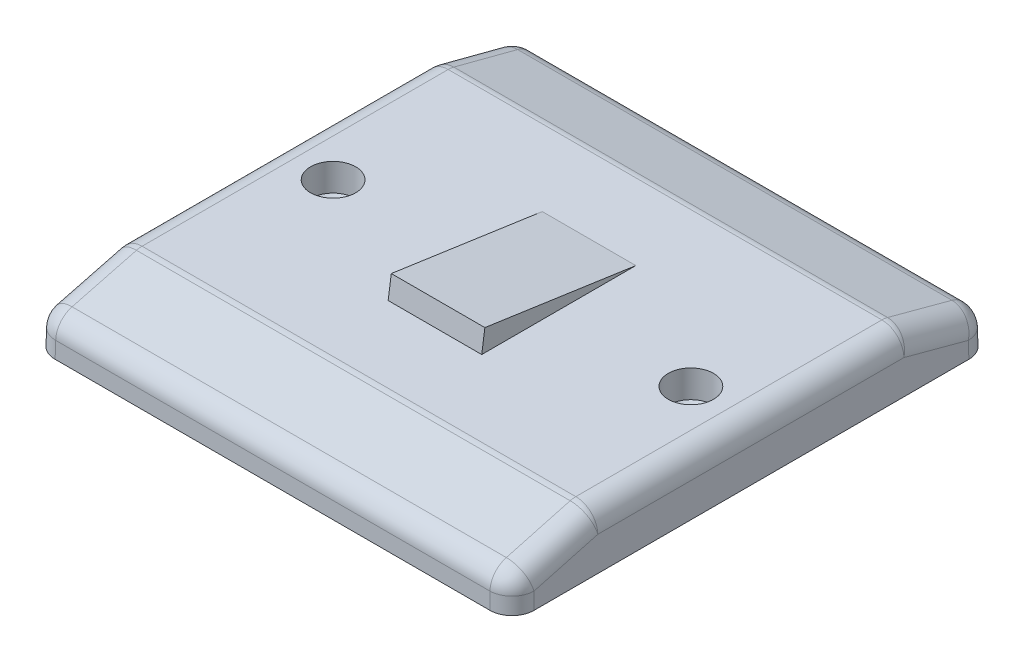
ISO-10303-21;
HEADER;
FILE_DESCRIPTION(('STEP AP214'),'2;1');
FILE_NAME('part.step','',(''),(''),'','','');
FILE_SCHEMA(('AUTOMOTIVE_DESIGN { 1 0 10303 214 1 1 1 1 }'));
ENDSEC;
DATA;
#1=APPLICATION_CONTEXT('core data for automotive mechanical design processes');
#2=APPLICATION_PROTOCOL_DEFINITION('international standard','automotive_design',2000,#1);
#3=PRODUCT_CONTEXT('',#1,'mechanical');
#4=PRODUCT('Part','Part','',(#3));
#5=PRODUCT_RELATED_PRODUCT_CATEGORY('part','',(#4));
#6=PRODUCT_DEFINITION_FORMATION('','',#4);
#7=PRODUCT_DEFINITION_CONTEXT('part definition',#1,'design');
#8=PRODUCT_DEFINITION('design','',#6,#7);
#9=PRODUCT_DEFINITION_SHAPE('','',#8);
#10=(LENGTH_UNIT() NAMED_UNIT(*) SI_UNIT(.MILLI.,.METRE.));
#11=(NAMED_UNIT(*) PLANE_ANGLE_UNIT() SI_UNIT($,.RADIAN.));
#12=(NAMED_UNIT(*) SI_UNIT($,.STERADIAN.) SOLID_ANGLE_UNIT());
#13=UNCERTAINTY_MEASURE_WITH_UNIT(LENGTH_MEASURE(1.E-05),#10,'distance_accuracy_value','');
#14=(GEOMETRIC_REPRESENTATION_CONTEXT(3) GLOBAL_UNCERTAINTY_ASSIGNED_CONTEXT((#13)) GLOBAL_UNIT_ASSIGNED_CONTEXT((#10,
#11,#12)) REPRESENTATION_CONTEXT('',''));
#15=CARTESIAN_POINT('',(0.,0.,0.));
#16=DIRECTION('',(0.,0.,1.));
#17=DIRECTION('',(1.,0.,0.));
#18=AXIS2_PLACEMENT_3D('',#15,#16,#17);
#19=CARTESIAN_POINT('',(0.,10.,0.));
#20=DIRECTION('',(0.,-1.,0.));
#21=DIRECTION('',(0.,0.,-1.));
#22=AXIS2_PLACEMENT_3D('',#19,#20,#21);
#23=PLANE('',#22);
#24=CARTESIAN_POINT('',(-32.5,10.,0.));
#25=DIRECTION('',(0.,1.,0.));
#26=DIRECTION('',(0.,0.,1.));
#27=AXIS2_PLACEMENT_3D('',#24,#25,#26);
#28=CIRCLE('',#27,4.1);
#29=CARTESIAN_POINT('',(-32.5,10.,4.1));
#30=VERTEX_POINT('',#29);
#31=EDGE_CURVE('E793',#30,#30,#28,.T.);
#32=ORIENTED_EDGE('',*,*,#31,.F.);
#33=EDGE_LOOP('',(#32));
#34=FACE_BOUND('',#33,.T.);
#35=CARTESIAN_POINT('',(32.5,10.,0.));
#36=DIRECTION('',(0.,1.,0.));
#37=DIRECTION('',(0.,0.,1.));
#38=AXIS2_PLACEMENT_3D('',#35,#36,#37);
#39=CIRCLE('',#38,4.1);
#40=CARTESIAN_POINT('',(32.5,10.,4.09999999999999));
#41=VERTEX_POINT('',#40);
#42=EDGE_CURVE('E803',#41,#41,#39,.T.);
#43=ORIENTED_EDGE('',*,*,#42,.F.);
#44=EDGE_LOOP('',(#43));
#45=FACE_BOUND('',#44,.T.);
#46=DIRECTION('',(-1.,0.,0.));
#47=VECTOR('',#46,1.);
#48=CARTESIAN_POINT('',(-43.3254493507178,10.,-27.8036982226521));
#49=LINE('',#48,#47);
#50=CARTESIAN_POINT('',(39.3946602982551,10.,-27.8036982226521));
#51=VERTEX_POINT('',#50);
#52=CARTESIAN_POINT('',(-39.3946602982551,10.,-27.8036982226521));
#53=VERTEX_POINT('',#52);
#54=EDGE_CURVE('E42',#51,#53,#49,.T.);
#55=ORIENTED_EDGE('',*,*,#54,.T.);
#56=DIRECTION('',(0.,0.,-1.));
#57=VECTOR('',#56,1.);
#58=CARTESIAN_POINT('',(-39.3946602982551,10.,0.));
#59=LINE('',#58,#57);
#60=CARTESIAN_POINT('',(-39.3946602982551,10.,27.8036982226521));
#61=VERTEX_POINT('',#60);
#62=EDGE_CURVE('E11',#53,#61,#59,.F.);
#63=ORIENTED_EDGE('',*,*,#62,.T.);
#64=DIRECTION('',(1.,0.,0.));
#65=VECTOR('',#64,1.);
#66=CARTESIAN_POINT('',(43.3254493507178,10.,27.8036982226521));
#67=LINE('',#66,#65);
#68=CARTESIAN_POINT('',(39.3946602982551,10.,27.8036982226521));
#69=VERTEX_POINT('',#68);
#70=EDGE_CURVE('E261',#61,#69,#67,.T.);
#71=ORIENTED_EDGE('',*,*,#70,.T.);
#72=DIRECTION('',(0.,0.,1.));
#73=VECTOR('',#72,1.);
#74=CARTESIAN_POINT('',(39.3946602982551,10.,0.));
#75=LINE('',#74,#73);
#76=EDGE_CURVE('E53',#69,#51,#75,.F.);
#77=ORIENTED_EDGE('',*,*,#76,.T.);
#78=EDGE_LOOP('',(#55,#63,#71,#77));
#79=FACE_BOUND('',#78,.T.);
#80=DIRECTION('',(0.,0.,-1.));
#81=VECTOR('',#80,1.);
#82=CARTESIAN_POINT('',(8.5,10.,-14.));
#83=LINE('',#82,#81);
#84=CARTESIAN_POINT('',(8.5,10.,14.));
#85=VERTEX_POINT('',#84);
#86=CARTESIAN_POINT('',(8.5,10.,-14.));
#87=VERTEX_POINT('',#86);
#88=EDGE_CURVE('E173',#85,#87,#83,.T.);
#89=ORIENTED_EDGE('',*,*,#88,.F.);
#90=DIRECTION('',(-1.,0.,0.));
#91=VECTOR('',#90,1.);
#92=CARTESIAN_POINT('',(8.5,10.,14.));
#93=LINE('',#92,#91);
#94=CARTESIAN_POINT('',(-8.5,10.,14.));
#95=VERTEX_POINT('',#94);
#96=EDGE_CURVE('E190',#85,#95,#93,.T.);
#97=ORIENTED_EDGE('',*,*,#96,.T.);
#98=DIRECTION('',(0.,0.,-1.));
#99=VECTOR('',#98,1.);
#100=CARTESIAN_POINT('',(-8.5,10.,-14.));
#101=LINE('',#100,#99);
#102=CARTESIAN_POINT('',(-8.5,10.,-14.));
#103=VERTEX_POINT('',#102);
#104=EDGE_CURVE('E184',#95,#103,#101,.T.);
#105=ORIENTED_EDGE('',*,*,#104,.T.);
#106=DIRECTION('',(-1.,0.,0.));
#107=VECTOR('',#106,1.);
#108=CARTESIAN_POINT('',(8.5,10.,-14.));
#109=LINE('',#108,#107);
#110=EDGE_CURVE('E166',#87,#103,#109,.T.);
#111=ORIENTED_EDGE('',*,*,#110,.F.);
#112=EDGE_LOOP('',(#89,#97,#105,#111));
#113=FACE_BOUND('',#112,.T.);
#114=ADVANCED_FACE('F33',(#34,#45,#79,#113),#23,.F.);
#115=CARTESIAN_POINT('',(43.5,0.,43.5));
#116=DIRECTION('',(0.999847695156391,0.0174524064372835,0.));
#117=DIRECTION('',(-0.0174524064372835,0.999847695156391,0.));
#118=AXIS2_PLACEMENT_3D('',#115,#116,#117);
#119=PLANE('',#118);
#120=DIRECTION('',(0.,0.,-1.));
#121=VECTOR('',#120,1.);
#122=CARTESIAN_POINT('',(43.5,0.,43.5));
#123=LINE('',#122,#121);
#124=CARTESIAN_POINT('',(43.5,0.,39.5006092193744));
#125=VERTEX_POINT('',#124);
#126=CARTESIAN_POINT('',(43.5,0.,-39.5006092193744));
#127=VERTEX_POINT('',#126);
#128=EDGE_CURVE('E185',#125,#127,#123,.T.);
#129=ORIENTED_EDGE('',*,*,#128,.T.);
#130=DIRECTION('',(-0.0174497491606827,0.999695459881888,0.0174497491606827));
#131=VECTOR('',#130,1.);
#132=CARTESIAN_POINT('',(43.4747268335975,1.44789873348481,-39.475336052972));
#133=LINE('',#132,#131);
#134=CARTESIAN_POINT('',(43.4479951271853,2.97935716816603,-39.4486043465598));
#135=VERTEX_POINT('',#134);
#136=EDGE_CURVE('E244',#127,#135,#133,.T.);
#137=ORIENTED_EDGE('',*,*,#136,.T.);
#138=DIRECTION('',(-0.0044773761209927,0.25650870617815,0.966531549799531));
#139=VECTOR('',#138,1.);
#140=CARTESIAN_POINT('',(43.3917938263774,6.199127535052,-27.3164249399725));
#141=LINE('',#140,#139);
#142=CARTESIAN_POINT('',(43.3940510788806,6.06980962574913,-27.8036982226521));
#143=VERTEX_POINT('',#142);
#144=EDGE_CURVE('E242',#135,#143,#141,.T.);
#145=ORIENTED_EDGE('',*,*,#144,.T.);
#146=DIRECTION('',(0.,0.,-1.));
#147=VECTOR('',#146,1.);
#148=CARTESIAN_POINT('',(43.3940510788806,6.06980962574913,43.5));
#149=LINE('',#148,#147);
#150=CARTESIAN_POINT('',(43.3940510788806,6.06980962574913,27.8036982226521));
#151=VERTEX_POINT('',#150);
#152=EDGE_CURVE('E238',#143,#151,#149,.F.);
#153=ORIENTED_EDGE('',*,*,#152,.T.);
#154=DIRECTION('',(0.0044773761209927,-0.25650870617815,0.966531549799531));
#155=VECTOR('',#154,1.);
#156=CARTESIAN_POINT('',(43.4616034521265,2.19973675442642,42.3862345657218));
#157=LINE('',#156,#155);
#158=CARTESIAN_POINT('',(43.4479951271853,2.97935716816603,39.4486043465597));
#159=VERTEX_POINT('',#158);
#160=EDGE_CURVE('E236',#151,#159,#157,.T.);
#161=ORIENTED_EDGE('',*,*,#160,.T.);
#162=DIRECTION('',(-0.0174497491606827,0.999695459881888,-0.0174497491606827));
#163=VECTOR('',#162,1.);
#164=CARTESIAN_POINT('',(43.5012177894796,-0.0697671125602638,39.501827008854));
#165=LINE('',#164,#163);
#166=EDGE_CURVE('E240',#159,#125,#165,.F.);
#167=ORIENTED_EDGE('',*,*,#166,.T.);
#168=EDGE_LOOP('',(#129,#137,#145,#153,#161,#167));
#169=FACE_BOUND('',#168,.T.);
#170=ADVANCED_FACE('F356',(#169),#119,.T.);
#171=CARTESIAN_POINT('',(-43.5,0.,-43.5));
#172=DIRECTION('',(0.,0.0174524064372835,-0.999847695156391));
#173=DIRECTION('',(0.,0.999847695156391,0.0174524064372835));
#174=AXIS2_PLACEMENT_3D('',#171,#172,#173);
#175=PLANE('',#174);
#176=DIRECTION('',(-1.,0.,0.));
#177=VECTOR('',#176,1.);
#178=CARTESIAN_POINT('',(-43.5,0.,-43.5));
#179=LINE('',#178,#177);
#180=CARTESIAN_POINT('',(39.5006092193744,0.,-43.5));
#181=VERTEX_POINT('',#180);
#182=CARTESIAN_POINT('',(-39.5006092193744,0.,-43.5));
#183=VERTEX_POINT('',#182);
#184=EDGE_CURVE('E188',#181,#183,#179,.T.);
#185=ORIENTED_EDGE('',*,*,#184,.T.);
#186=DIRECTION('',(0.0174497491606827,0.999695459881888,0.0174497491606827));
#187=VECTOR('',#186,1.);
#188=CARTESIAN_POINT('',(-39.501827008854,-0.0697671125602636,-43.5012177894796));
#189=LINE('',#188,#187);
#190=CARTESIAN_POINT('',(-39.4486043465597,2.97935716816603,-43.4479951271853));
#191=VERTEX_POINT('',#190);
#192=EDGE_CURVE('E207',#183,#191,#189,.T.);
#193=ORIENTED_EDGE('',*,*,#192,.T.);
#194=DIRECTION('',(1.,0.,0.));
#195=VECTOR('',#194,1.);
#196=CARTESIAN_POINT('',(43.3952589764669,2.97935716816603,-43.4479951271853));
#197=LINE('',#196,#195);
#198=CARTESIAN_POINT('',(39.4486043465598,2.97935716816603,-43.4479951271853));
#199=VERTEX_POINT('',#198);
#200=EDGE_CURVE('E204',#191,#199,#197,.T.);
#201=ORIENTED_EDGE('',*,*,#200,.T.);
#202=DIRECTION('',(-0.0174497491606827,0.999695459881888,0.0174497491606827));
#203=VECTOR('',#202,1.);
#204=CARTESIAN_POINT('',(39.475336052972,1.44789873348481,-43.4747268335975));
#205=LINE('',#204,#203);
#206=EDGE_CURVE('E202',#199,#181,#205,.F.);
#207=ORIENTED_EDGE('',*,*,#206,.T.);
#208=EDGE_LOOP('',(#185,#193,#201,#207));
#209=FACE_BOUND('',#208,.T.);
#210=ADVANCED_FACE('F362',(#209),#175,.T.);
#211=CARTESIAN_POINT('',(-43.5,0.,43.5));
#212=DIRECTION('',(-0.999847695156391,0.0174524064372835,0.));
#213=DIRECTION('',(-0.0174524064372835,-0.999847695156391,0.));
#214=AXIS2_PLACEMENT_3D('',#211,#212,#213);
#215=PLANE('',#214);
#216=DIRECTION('',(-0.0044773761209927,-0.25650870617815,-0.966531549799531));
#217=VECTOR('',#216,1.);
#218=CARTESIAN_POINT('',(-43.4616034521265,2.19973675442641,-42.3862345657219));
#219=LINE('',#218,#217);
#220=CARTESIAN_POINT('',(-43.3940510788806,6.06980962574913,-27.8036982226521));
#221=VERTEX_POINT('',#220);
#222=CARTESIAN_POINT('',(-43.4479951271853,2.97935716816603,-39.4486043465598));
#223=VERTEX_POINT('',#222);
#224=EDGE_CURVE('E220',#221,#223,#219,.T.);
#225=ORIENTED_EDGE('',*,*,#224,.T.);
#226=DIRECTION('',(0.0174497491606827,0.999695459881888,0.0174497491606827));
#227=VECTOR('',#226,1.);
#228=CARTESIAN_POINT('',(-43.4747268335975,1.44789873348481,-39.475336052972));
#229=LINE('',#228,#227);
#230=CARTESIAN_POINT('',(-43.5,0.,-39.5006092193744));
#231=VERTEX_POINT('',#230);
#232=EDGE_CURVE('E226',#223,#231,#229,.F.);
#233=ORIENTED_EDGE('',*,*,#232,.T.);
#234=DIRECTION('',(0.,0.,1.));
#235=VECTOR('',#234,1.);
#236=CARTESIAN_POINT('',(-43.5,0.,43.5));
#237=LINE('',#236,#235);
#238=CARTESIAN_POINT('',(-43.5,0.,39.5006092193744));
#239=VERTEX_POINT('',#238);
#240=EDGE_CURVE('E196',#231,#239,#237,.T.);
#241=ORIENTED_EDGE('',*,*,#240,.T.);
#242=DIRECTION('',(0.0174497491606827,0.999695459881888,-0.0174497491606827));
#243=VECTOR('',#242,1.);
#244=CARTESIAN_POINT('',(-43.5012177894796,-0.0697671125602638,39.501827008854));
#245=LINE('',#244,#243);
#246=CARTESIAN_POINT('',(-43.4479951271853,2.97935716816603,39.4486043465597));
#247=VERTEX_POINT('',#246);
#248=EDGE_CURVE('E224',#239,#247,#245,.T.);
#249=ORIENTED_EDGE('',*,*,#248,.T.);
#250=DIRECTION('',(0.0044773761209927,0.25650870617815,-0.966531549799531));
#251=VECTOR('',#250,1.);
#252=CARTESIAN_POINT('',(-43.3917938263774,6.19912753505201,27.3164249399724));
#253=LINE('',#252,#251);
#254=CARTESIAN_POINT('',(-43.3940510788806,6.06980962574913,27.8036982226521));
#255=VERTEX_POINT('',#254);
#256=EDGE_CURVE('E222',#247,#255,#253,.T.);
#257=ORIENTED_EDGE('',*,*,#256,.T.);
#258=DIRECTION('',(0.,0.,1.));
#259=VECTOR('',#258,1.);
#260=CARTESIAN_POINT('',(-43.3940510788806,6.06980962574913,43.5));
#261=LINE('',#260,#259);
#262=EDGE_CURVE('E218',#255,#221,#261,.F.);
#263=ORIENTED_EDGE('',*,*,#262,.T.);
#264=EDGE_LOOP('',(#225,#233,#241,#249,#257,#263));
#265=FACE_BOUND('',#264,.T.);
#266=ADVANCED_FACE('F377',(#265),#215,.T.);
#267=CARTESIAN_POINT('',(-43.5,0.,43.5));
#268=DIRECTION('',(0.,0.0174524064372835,0.999847695156391));
#269=DIRECTION('',(0.,-0.999847695156391,0.0174524064372835));
#270=AXIS2_PLACEMENT_3D('',#267,#268,#269);
#271=PLANE('',#270);
#272=DIRECTION('',(1.,0.,0.));
#273=VECTOR('',#272,1.);
#274=CARTESIAN_POINT('',(-43.5,0.,43.5));
#275=LINE('',#274,#273);
#276=CARTESIAN_POINT('',(-39.5006092193744,0.,43.5));
#277=VERTEX_POINT('',#276);
#278=CARTESIAN_POINT('',(39.5006092193744,0.,43.5));
#279=VERTEX_POINT('',#278);
#280=EDGE_CURVE('E199',#277,#279,#275,.T.);
#281=ORIENTED_EDGE('',*,*,#280,.T.);
#282=DIRECTION('',(-0.0174497491606827,0.999695459881888,-0.0174497491606827));
#283=VECTOR('',#282,1.);
#284=CARTESIAN_POINT('',(39.475336052972,1.44789873348481,43.4747268335975));
#285=LINE('',#284,#283);
#286=CARTESIAN_POINT('',(39.4486043465598,2.97935716816603,43.4479951271853));
#287=VERTEX_POINT('',#286);
#288=EDGE_CURVE('E250',#279,#287,#285,.T.);
#289=ORIENTED_EDGE('',*,*,#288,.T.);
#290=DIRECTION('',(-1.,0.,0.));
#291=VECTOR('',#290,1.);
#292=CARTESIAN_POINT('',(-43.3952589764669,2.97935716816603,43.4479951271853));
#293=LINE('',#292,#291);
#294=CARTESIAN_POINT('',(-39.4486043465597,2.97935716816603,43.4479951271853));
#295=VERTEX_POINT('',#294);
#296=EDGE_CURVE('E246',#287,#295,#293,.T.);
#297=ORIENTED_EDGE('',*,*,#296,.T.);
#298=DIRECTION('',(0.0174497491606827,0.999695459881888,-0.0174497491606827));
#299=VECTOR('',#298,1.);
#300=CARTESIAN_POINT('',(-39.501827008854,-0.0697671125602638,43.5012177894796));
#301=LINE('',#300,#299);
#302=EDGE_CURVE('E248',#295,#277,#301,.F.);
#303=ORIENTED_EDGE('',*,*,#302,.T.);
#304=EDGE_LOOP('',(#281,#289,#297,#303));
#305=FACE_BOUND('',#304,.T.);
#306=ADVANCED_FACE('F372',(#305),#271,.T.);
#307=CARTESIAN_POINT('',(0.,0.,0.));
#308=DIRECTION('',(0.,-1.,0.));
#309=DIRECTION('',(0.,0.,-1.));
#310=AXIS2_PLACEMENT_3D('',#307,#308,#309);
#311=PLANE('',#310);
#312=CARTESIAN_POINT('',(-32.5,0.,0.));
#313=DIRECTION('',(0.,1.,0.));
#314=DIRECTION('',(0.,0.,1.));
#315=AXIS2_PLACEMENT_3D('',#312,#313,#314);
#316=CIRCLE('',#315,1.95);
#317=CARTESIAN_POINT('',(-32.5,0.,1.94999999999999));
#318=VERTEX_POINT('',#317);
#319=EDGE_CURVE('E800',#318,#318,#316,.T.);
#320=ORIENTED_EDGE('',*,*,#319,.T.);
#321=EDGE_LOOP('',(#320));
#322=FACE_BOUND('',#321,.T.);
#323=CARTESIAN_POINT('',(32.5,0.,0.));
#324=DIRECTION('',(0.,1.,0.));
#325=DIRECTION('',(0.,0.,1.));
#326=AXIS2_PLACEMENT_3D('',#323,#324,#325);
#327=CIRCLE('',#326,1.95);
#328=CARTESIAN_POINT('',(32.5,0.,1.94999999999999));
#329=VERTEX_POINT('',#328);
#330=EDGE_CURVE('E268',#329,#329,#327,.T.);
#331=ORIENTED_EDGE('',*,*,#330,.T.);
#332=EDGE_LOOP('',(#331));
#333=FACE_BOUND('',#332,.T.);
#334=ORIENTED_EDGE('',*,*,#240,.F.);
#335=CARTESIAN_POINT('',(-39.4993906878244,0.,-39.4993906878244));
#336=DIRECTION('',(0.,-1.,0.));
#337=DIRECTION('',(-0.707106781186548,0.,-0.707106781186548));
#338=AXIS2_PLACEMENT_3D('',#335,#336,#337);
#339=ELLIPSE('',#338,4.0012185315642,4.);
#340=EDGE_CURVE('E234',#231,#183,#339,.T.);
#341=ORIENTED_EDGE('',*,*,#340,.T.);
#342=ORIENTED_EDGE('',*,*,#184,.F.);
#343=CARTESIAN_POINT('',(39.4993906878244,0.,-39.4993906878244));
#344=DIRECTION('',(0.,-1.,0.));
#345=DIRECTION('',(0.707106781186548,0.,-0.707106781186548));
#346=AXIS2_PLACEMENT_3D('',#343,#344,#345);
#347=ELLIPSE('',#346,4.0012185315642,4.);
#348=EDGE_CURVE('E232',#181,#127,#347,.T.);
#349=ORIENTED_EDGE('',*,*,#348,.T.);
#350=ORIENTED_EDGE('',*,*,#128,.F.);
#351=CARTESIAN_POINT('',(39.4993906878244,0.,39.4993906878244));
#352=DIRECTION('',(0.,-1.,0.));
#353=DIRECTION('',(0.707106781186548,0.,0.707106781186548));
#354=AXIS2_PLACEMENT_3D('',#351,#352,#353);
#355=ELLIPSE('',#354,4.0012185315642,4.);
#356=EDGE_CURVE('E230',#125,#279,#355,.T.);
#357=ORIENTED_EDGE('',*,*,#356,.T.);
#358=ORIENTED_EDGE('',*,*,#280,.F.);
#359=CARTESIAN_POINT('',(-39.4993906878244,0.,39.4993906878244));
#360=DIRECTION('',(0.,-1.,0.));
#361=DIRECTION('',(-0.707106781186548,0.,0.707106781186548));
#362=AXIS2_PLACEMENT_3D('',#359,#360,#361);
#363=ELLIPSE('',#362,4.0012185315642,4.);
#364=EDGE_CURVE('E228',#277,#239,#363,.T.);
#365=ORIENTED_EDGE('',*,*,#364,.T.);
#366=EDGE_LOOP('',(#334,#341,#342,#349,#350,#357,#358,#365));
#367=FACE_BOUND('',#366,.T.);
#368=ADVANCED_FACE('F369',(#322,#333,#367),#311,.T.);
#369=CARTESIAN_POINT('',(0.,10.,-28.3254493507176));
#370=DIRECTION('',(0.,0.966541237924372,-0.256511277318604));
#371=DIRECTION('',(1.,0.,0.));
#372=AXIS2_PLACEMENT_3D('',#369,#370,#371);
#373=PLANE('',#372);
#374=DIRECTION('',(0.0044773761209927,-0.25650870617815,-0.966531549799531));
#375=VECTOR('',#374,1.);
#376=CARTESIAN_POINT('',(39.4622126715009,5.99609208037477,-43.4122796749963));
#377=LINE('',#376,#375);
#378=CARTESIAN_POINT('',(39.3946602982551,9.86616495169749,-28.8297433319265));
#379=VERTEX_POINT('',#378);
#380=CARTESIAN_POINT('',(39.4486043465598,6.77571249411439,-40.4746494558342));
#381=VERTEX_POINT('',#380);
#382=EDGE_CURVE('E213',#379,#381,#377,.T.);
#383=ORIENTED_EDGE('',*,*,#382,.T.);
#384=DIRECTION('',(-1.,0.,0.));
#385=VECTOR('',#384,1.);
#386=CARTESIAN_POINT('',(-43.3952589764669,6.77571249411439,-40.4746494558342));
#387=LINE('',#386,#385);
#388=CARTESIAN_POINT('',(-39.4486043465597,6.77571249411439,-40.4746494558342));
#389=VERTEX_POINT('',#388);
#390=EDGE_CURVE('E215',#381,#389,#387,.T.);
#391=ORIENTED_EDGE('',*,*,#390,.T.);
#392=DIRECTION('',(0.0044773761209927,0.25650870617815,0.966531549799531));
#393=VECTOR('',#392,1.);
#394=CARTESIAN_POINT('',(-39.3924030457518,9.99548286100035,-28.3424700492469));
#395=LINE('',#394,#393);
#396=CARTESIAN_POINT('',(-39.394660298255,9.86616495169749,-28.8297433319265));
#397=VERTEX_POINT('',#396);
#398=EDGE_CURVE('E211',#389,#397,#395,.T.);
#399=ORIENTED_EDGE('',*,*,#398,.T.);
#400=DIRECTION('',(-1.,0.,0.));
#401=VECTOR('',#400,1.);
#402=CARTESIAN_POINT('',(43.3254493507178,9.86616495169749,-28.8297433319265));
#403=LINE('',#402,#401);
#404=EDGE_CURVE('E209',#397,#379,#403,.F.);
#405=ORIENTED_EDGE('',*,*,#404,.T.);
#406=EDGE_LOOP('',(#383,#391,#399,#405));
#407=FACE_BOUND('',#406,.T.);
#408=ADVANCED_FACE('F371',(#407),#373,.T.);
#409=CARTESIAN_POINT('',(0.,10.,28.3254493507176));
#410=DIRECTION('',(0.,0.966541237924372,0.256511277318604));
#411=DIRECTION('',(-1.,0.,0.));
#412=AXIS2_PLACEMENT_3D('',#409,#410,#411);
#413=PLANE('',#412);
#414=DIRECTION('',(-0.0044773761209927,-0.25650870617815,0.966531549799531));
#415=VECTOR('',#414,1.);
#416=CARTESIAN_POINT('',(-39.4622126715009,5.99609208037477,43.4122796749962));
#417=LINE('',#416,#415);
#418=CARTESIAN_POINT('',(-39.3946602982551,9.86616495169749,28.8297433319265));
#419=VERTEX_POINT('',#418);
#420=CARTESIAN_POINT('',(-39.4486043465597,6.77571249411439,40.4746494558342));
#421=VERTEX_POINT('',#420);
#422=EDGE_CURVE('E256',#419,#421,#417,.T.);
#423=ORIENTED_EDGE('',*,*,#422,.T.);
#424=DIRECTION('',(1.,0.,0.));
#425=VECTOR('',#424,1.);
#426=CARTESIAN_POINT('',(43.395258976467,6.77571249411439,40.4746494558342));
#427=LINE('',#426,#425);
#428=CARTESIAN_POINT('',(39.4486043465598,6.77571249411439,40.4746494558342));
#429=VERTEX_POINT('',#428);
#430=EDGE_CURVE('E259',#421,#429,#427,.T.);
#431=ORIENTED_EDGE('',*,*,#430,.T.);
#432=DIRECTION('',(-0.0044773761209927,0.25650870617815,-0.966531549799531));
#433=VECTOR('',#432,1.);
#434=CARTESIAN_POINT('',(39.3924030457518,9.99548286100037,28.3424700492468));
#435=LINE('',#434,#433);
#436=CARTESIAN_POINT('',(39.3946602982551,9.86616495169749,28.8297433319265));
#437=VERTEX_POINT('',#436);
#438=EDGE_CURVE('E254',#429,#437,#435,.T.);
#439=ORIENTED_EDGE('',*,*,#438,.T.);
#440=DIRECTION('',(1.,0.,0.));
#441=VECTOR('',#440,1.);
#442=CARTESIAN_POINT('',(-43.3254493507178,9.86616495169749,28.8297433319265));
#443=LINE('',#442,#441);
#444=EDGE_CURVE('E252',#437,#419,#443,.F.);
#445=ORIENTED_EDGE('',*,*,#444,.T.);
#446=EDGE_LOOP('',(#423,#431,#439,#445));
#447=FACE_BOUND('',#446,.T.);
#448=ADVANCED_FACE('F387',(#447),#413,.T.);
#449=CARTESIAN_POINT('',(8.5,13.9589732744432,13.4285714285714));
#450=DIRECTION('',(0.,-0.989743318610787,0.142857142857143));
#451=DIRECTION('',(0.,-0.142857142857143,-0.989743318610787));
#452=AXIS2_PLACEMENT_3D('',#449,#450,#451);
#453=PLANE('',#452);
#454=DIRECTION('',(0.,0.142857142857143,0.989743318610787));
#455=VECTOR('',#454,1.);
#456=CARTESIAN_POINT('',(-8.5,13.9589732744432,13.4285714285714));
#457=LINE('',#456,#455);
#458=CARTESIAN_POINT('',(-8.5,13.9589732744432,13.4285714285714));
#459=VERTEX_POINT('',#458);
#460=EDGE_CURVE('E335',#103,#459,#457,.T.);
#461=ORIENTED_EDGE('',*,*,#460,.T.);
#462=DIRECTION('',(-1.,0.,0.));
#463=VECTOR('',#462,1.);
#464=CARTESIAN_POINT('',(8.5,13.9589732744432,13.4285714285714));
#465=LINE('',#464,#463);
#466=CARTESIAN_POINT('',(8.5,13.9589732744432,13.4285714285714));
#467=VERTEX_POINT('',#466);
#468=EDGE_CURVE('E169',#467,#459,#465,.T.);
#469=ORIENTED_EDGE('',*,*,#468,.F.);
#470=DIRECTION('',(0.,0.142857142857143,0.989743318610787));
#471=VECTOR('',#470,1.);
#472=CARTESIAN_POINT('',(8.5,13.9589732744432,13.4285714285714));
#473=LINE('',#472,#471);
#474=EDGE_CURVE('E162',#87,#467,#473,.T.);
#475=ORIENTED_EDGE('',*,*,#474,.F.);
#476=ORIENTED_EDGE('',*,*,#110,.T.);
#477=EDGE_LOOP('',(#461,#469,#475,#476));
#478=FACE_BOUND('',#477,.T.);
#479=ADVANCED_FACE('F164',(#478),#453,.F.);
#480=CARTESIAN_POINT('',(8.5,10.,14.));
#481=DIRECTION('',(0.,-0.142857142857143,-0.989743318610787));
#482=DIRECTION('',(0.,0.989743318610787,-0.142857142857143));
#483=AXIS2_PLACEMENT_3D('',#480,#481,#482);
#484=PLANE('',#483);
#485=DIRECTION('',(0.,-0.989743318610787,0.142857142857143));
#486=VECTOR('',#485,1.);
#487=CARTESIAN_POINT('',(-8.5,10.,14.));
#488=LINE('',#487,#486);
#489=EDGE_CURVE('E180',#459,#95,#488,.T.);
#490=ORIENTED_EDGE('',*,*,#489,.T.);
#491=ORIENTED_EDGE('',*,*,#96,.F.);
#492=DIRECTION('',(0.,-0.989743318610787,0.142857142857143));
#493=VECTOR('',#492,1.);
#494=CARTESIAN_POINT('',(8.5,10.,14.));
#495=LINE('',#494,#493);
#496=EDGE_CURVE('E172',#467,#85,#495,.T.);
#497=ORIENTED_EDGE('',*,*,#496,.F.);
#498=ORIENTED_EDGE('',*,*,#468,.T.);
#499=EDGE_LOOP('',(#490,#491,#497,#498));
#500=FACE_BOUND('',#499,.T.);
#501=ADVANCED_FACE('F341',(#500),#484,.F.);
#502=CARTESIAN_POINT('',(8.5,0.,0.));
#503=DIRECTION('',(-1.,0.,0.));
#504=DIRECTION('',(0.,0.,1.));
#505=AXIS2_PLACEMENT_3D('',#502,#503,#504);
#506=PLANE('',#505);
#507=ORIENTED_EDGE('',*,*,#88,.T.);
#508=ORIENTED_EDGE('',*,*,#474,.T.);
#509=ORIENTED_EDGE('',*,*,#496,.T.);
#510=EDGE_LOOP('',(#507,#508,#509));
#511=FACE_BOUND('',#510,.T.);
#512=ADVANCED_FACE('F176',(#511),#506,.F.);
#513=CARTESIAN_POINT('',(-8.5,0.,0.));
#514=DIRECTION('',(-1.,0.,0.));
#515=DIRECTION('',(0.,0.,1.));
#516=AXIS2_PLACEMENT_3D('',#513,#514,#515);
#517=PLANE('',#516);
#518=ORIENTED_EDGE('',*,*,#104,.F.);
#519=ORIENTED_EDGE('',*,*,#489,.F.);
#520=ORIENTED_EDGE('',*,*,#460,.F.);
#521=EDGE_LOOP('',(#518,#519,#520));
#522=FACE_BOUND('',#521,.T.);
#523=ADVANCED_FACE('F344',(#522),#517,.T.);
#524=CARTESIAN_POINT('',(-39.501827008854,-0.139576738309398,39.501827008854));
#525=DIRECTION('',(-0.0174497491606827,-0.999695459881887,0.0174497491606827));
#526=DIRECTION('',(0.,-0.0174524064372835,-0.999847695156391));
#527=AXIS2_PLACEMENT_3D('',#524,#525,#526);
#528=CYLINDRICAL_SURFACE('',#527,4.);
#529=ORIENTED_EDGE('',*,*,#364,.F.);
#530=ORIENTED_EDGE('',*,*,#302,.F.);
#531=CARTESIAN_POINT('',(-39.4486043465597,2.9095475424169,39.4486043465597));
#532=DIRECTION('',(0.0174497491606827,0.999695459881887,-0.0174497491606825));
#533=DIRECTION('',(-0.999847695156391,0.0174524064372835,0.));
#534=AXIS2_PLACEMENT_3D('',#531,#532,#533);
#535=CIRCLE('',#534,4.);
#536=EDGE_CURVE('E327',#247,#295,#535,.T.);
#537=ORIENTED_EDGE('',*,*,#536,.F.);
#538=ORIENTED_EDGE('',*,*,#248,.F.);
#539=EDGE_LOOP('',(#529,#530,#537,#538));
#540=FACE_BOUND('',#539,.T.);
#541=ADVANCED_FACE('F35',(#540),#528,.T.);
#542=CARTESIAN_POINT('',(39.501827008854,-0.139576738309398,39.501827008854));
#543=DIRECTION('',(0.0174497491606827,-0.999695459881887,0.0174497491606827));
#544=DIRECTION('',(0.,-0.0174524064372835,-0.999847695156391));
#545=AXIS2_PLACEMENT_3D('',#542,#543,#544);
#546=CYLINDRICAL_SURFACE('',#545,4.);
#547=ORIENTED_EDGE('',*,*,#356,.F.);
#548=ORIENTED_EDGE('',*,*,#166,.F.);
#549=CARTESIAN_POINT('',(39.4486043465598,2.9095475424169,39.4486043465597));
#550=DIRECTION('',(-0.0174497491606827,0.999695459881887,-0.0174497491606827));
#551=DIRECTION('',(0.,0.0174524064372835,0.999847695156391));
#552=AXIS2_PLACEMENT_3D('',#549,#550,#551);
#553=CIRCLE('',#552,4.);
#554=EDGE_CURVE('E325',#287,#159,#553,.T.);
#555=ORIENTED_EDGE('',*,*,#554,.F.);
#556=ORIENTED_EDGE('',*,*,#288,.F.);
#557=EDGE_LOOP('',(#547,#548,#555,#556));
#558=FACE_BOUND('',#557,.T.);
#559=ADVANCED_FACE('F351',(#558),#546,.T.);
#560=CARTESIAN_POINT('',(-43.5,2.9095475424169,39.4486043465597));
#561=DIRECTION('',(-1.,0.,0.));
#562=DIRECTION('',(0.,0.,1.));
#563=AXIS2_PLACEMENT_3D('',#560,#561,#562);
#564=CYLINDRICAL_SURFACE('',#563,4.);
#565=CARTESIAN_POINT('',(-39.4486043465597,2.9095475424169,39.4486043465597));
#566=DIRECTION('',(-1.,0.,0.));
#567=DIRECTION('',(0.,0.,1.));
#568=AXIS2_PLACEMENT_3D('',#565,#566,#567);
#569=CIRCLE('',#568,4.);
#570=EDGE_CURVE('E37',#295,#421,#569,.T.);
#571=ORIENTED_EDGE('',*,*,#570,.F.);
#572=ORIENTED_EDGE('',*,*,#296,.F.);
#573=CARTESIAN_POINT('',(39.4486043465598,2.9095475424169,39.4486043465597));
#574=DIRECTION('',(1.,0.,0.));
#575=DIRECTION('',(0.,0.,-1.));
#576=AXIS2_PLACEMENT_3D('',#573,#574,#575);
#577=CIRCLE('',#576,4.);
#578=EDGE_CURVE('E322',#429,#287,#577,.T.);
#579=ORIENTED_EDGE('',*,*,#578,.F.);
#580=ORIENTED_EDGE('',*,*,#430,.F.);
#581=EDGE_LOOP('',(#571,#572,#579,#580));
#582=FACE_BOUND('',#581,.T.);
#583=ADVANCED_FACE('F468',(#582),#564,.T.);
#584=CARTESIAN_POINT('',(-39.4486043465597,2.9095475424169,39.4486043465597));
#585=DIRECTION('',(0.,0.,1.));
#586=DIRECTION('',(1.,0.,0.));
#587=AXIS2_PLACEMENT_3D('',#584,#585,#586);
#588=SPHERICAL_SURFACE('',#587,4.);
#589=ORIENTED_EDGE('',*,*,#536,.T.);
#590=ORIENTED_EDGE('',*,*,#570,.T.);
#591=CARTESIAN_POINT('',(-39.4486043465597,2.9095475424169,39.4486043465597));
#592=DIRECTION('',(-0.0044773761209927,-0.25650870617815,0.966531549799531));
#593=DIRECTION('',(0.,-0.966541237924372,-0.256511277318605));
#594=AXIS2_PLACEMENT_3D('',#591,#592,#593);
#595=CIRCLE('',#594,4.);
#596=EDGE_CURVE('E320',#247,#421,#595,.F.);
#597=ORIENTED_EDGE('',*,*,#596,.F.);
#598=EDGE_LOOP('',(#589,#590,#597));
#599=FACE_BOUND('',#598,.T.);
#600=ADVANCED_FACE('F464',(#599),#588,.T.);
#601=CARTESIAN_POINT('',(39.4486043465598,2.9095475424169,39.4486043465597));
#602=DIRECTION('',(0.,0.,1.));
#603=DIRECTION('',(1.,0.,0.));
#604=AXIS2_PLACEMENT_3D('',#601,#602,#603);
#605=SPHERICAL_SURFACE('',#604,4.);
#606=ORIENTED_EDGE('',*,*,#578,.T.);
#607=ORIENTED_EDGE('',*,*,#554,.T.);
#608=CARTESIAN_POINT('',(39.4486043465598,2.9095475424169,39.4486043465597));
#609=DIRECTION('',(0.0044773761209927,-0.25650870617815,0.966531549799531));
#610=DIRECTION('',(0.,-0.966541237924372,-0.256511277318605));
#611=AXIS2_PLACEMENT_3D('',#608,#609,#610);
#612=CIRCLE('',#611,4.);
#613=EDGE_CURVE('E317',#429,#159,#612,.F.);
#614=ORIENTED_EDGE('',*,*,#613,.F.);
#615=EDGE_LOOP('',(#606,#607,#614));
#616=FACE_BOUND('',#615,.T.);
#617=ADVANCED_FACE('F460',(#616),#605,.T.);
#618=CARTESIAN_POINT('',(-39.4695596560759,1.70901866427746,43.9722287274076));
#619=DIRECTION('',(0.0044773761209927,0.25650870617815,-0.966531549799531));
#620=DIRECTION('',(0.,0.966541237924372,0.256511277318604));
#621=AXIS2_PLACEMENT_3D('',#618,#619,#620);
#622=CYLINDRICAL_SURFACE('',#621,4.);
#623=ORIENTED_EDGE('',*,*,#596,.T.);
#624=ORIENTED_EDGE('',*,*,#422,.F.);
#625=CARTESIAN_POINT('',(-39.3946602982551,6.,27.8036982226521));
#626=DIRECTION('',(0.00447737612099274,0.256508706178151,-0.966531549799531));
#627=DIRECTION('',(0.,0.966541237924372,0.256511277318606));
#628=AXIS2_PLACEMENT_3D('',#625,#626,#627);
#629=CIRCLE('',#628,4.);
#630=EDGE_CURVE('E311',#255,#419,#629,.T.);
#631=ORIENTED_EDGE('',*,*,#630,.F.);
#632=ORIENTED_EDGE('',*,*,#256,.F.);
#633=EDGE_LOOP('',(#623,#624,#631,#632));
#634=FACE_BOUND('',#633,.T.);
#635=ADVANCED_FACE('F456',(#634),#622,.T.);
#636=CARTESIAN_POINT('',(39.4695596560759,1.70901866427746,43.9722287274076));
#637=DIRECTION('',(0.0044773761209927,-0.25650870617815,0.966531549799531));
#638=DIRECTION('',(0.,-0.966541237924372,-0.256511277318604));
#639=AXIS2_PLACEMENT_3D('',#636,#637,#638);
#640=CYLINDRICAL_SURFACE('',#639,4.);
#641=ORIENTED_EDGE('',*,*,#613,.T.);
#642=ORIENTED_EDGE('',*,*,#160,.F.);
#643=CARTESIAN_POINT('',(39.3946602982551,6.,27.8036982226521));
#644=DIRECTION('',(-0.0044773761209935,0.25650870617815,-0.966531549799531));
#645=DIRECTION('',(0.,0.966541237924372,0.256511277318605));
#646=AXIS2_PLACEMENT_3D('',#643,#644,#645);
#647=CIRCLE('',#646,4.);
#648=EDGE_CURVE('E308',#437,#151,#647,.T.);
#649=ORIENTED_EDGE('',*,*,#648,.F.);
#650=ORIENTED_EDGE('',*,*,#438,.F.);
#651=EDGE_LOOP('',(#641,#642,#649,#650));
#652=FACE_BOUND('',#651,.T.);
#653=ADVANCED_FACE('F452',(#652),#640,.T.);
#654=CARTESIAN_POINT('',(0.,6.,27.8036982226521));
#655=DIRECTION('',(-1.,0.,0.));
#656=DIRECTION('',(0.,0.,1.));
#657=AXIS2_PLACEMENT_3D('',#654,#655,#656);
#658=CYLINDRICAL_SURFACE('',#657,4.);
#659=CARTESIAN_POINT('',(-39.3946602982551,6.,27.8036982226521));
#660=DIRECTION('',(-1.,0.,0.));
#661=DIRECTION('',(0.,0.,1.));
#662=AXIS2_PLACEMENT_3D('',#659,#660,#661);
#663=CIRCLE('',#662,4.);
#664=EDGE_CURVE('E314',#419,#61,#663,.T.);
#665=ORIENTED_EDGE('',*,*,#664,.F.);
#666=ORIENTED_EDGE('',*,*,#444,.F.);
#667=CARTESIAN_POINT('',(39.3946602982551,6.,27.8036982226521));
#668=DIRECTION('',(1.,0.,0.));
#669=DIRECTION('',(0.,0.,-1.));
#670=AXIS2_PLACEMENT_3D('',#667,#668,#669);
#671=CIRCLE('',#670,4.);
#672=EDGE_CURVE('E305',#69,#437,#671,.T.);
#673=ORIENTED_EDGE('',*,*,#672,.F.);
#674=ORIENTED_EDGE('',*,*,#70,.F.);
#675=EDGE_LOOP('',(#665,#666,#673,#674));
#676=FACE_BOUND('',#675,.T.);
#677=ADVANCED_FACE('F448',(#676),#658,.T.);
#678=CARTESIAN_POINT('',(-39.3946602982551,6.,27.8036982226521));
#679=DIRECTION('',(0.,0.,1.));
#680=DIRECTION('',(1.,0.,0.));
#681=AXIS2_PLACEMENT_3D('',#678,#679,#680);
#682=SPHERICAL_SURFACE('',#681,4.);
#683=ORIENTED_EDGE('',*,*,#630,.T.);
#684=ORIENTED_EDGE('',*,*,#664,.T.);
#685=CARTESIAN_POINT('',(-39.3946602982551,6.,27.8036982226521));
#686=DIRECTION('',(0.,0.,1.));
#687=DIRECTION('',(1.,0.,0.));
#688=AXIS2_PLACEMENT_3D('',#685,#686,#687);
#689=CIRCLE('',#688,4.);
#690=EDGE_CURVE('E303',#255,#61,#689,.F.);
#691=ORIENTED_EDGE('',*,*,#690,.F.);
#692=EDGE_LOOP('',(#683,#684,#691));
#693=FACE_BOUND('',#692,.T.);
#694=ADVANCED_FACE('F444',(#693),#682,.T.);
#695=CARTESIAN_POINT('',(39.3946602982551,6.,27.8036982226521));
#696=DIRECTION('',(0.,0.,1.));
#697=DIRECTION('',(1.,0.,0.));
#698=AXIS2_PLACEMENT_3D('',#695,#696,#697);
#699=SPHERICAL_SURFACE('',#698,4.);
#700=ORIENTED_EDGE('',*,*,#672,.T.);
#701=ORIENTED_EDGE('',*,*,#648,.T.);
#702=CARTESIAN_POINT('',(39.3946602982551,6.,27.8036982226521));
#703=DIRECTION('',(0.,0.,1.));
#704=DIRECTION('',(0.,-1.,0.));
#705=AXIS2_PLACEMENT_3D('',#702,#703,#704);
#706=CIRCLE('',#705,4.);
#707=EDGE_CURVE('E300',#69,#151,#706,.F.);
#708=ORIENTED_EDGE('',*,*,#707,.F.);
#709=EDGE_LOOP('',(#700,#701,#708));
#710=FACE_BOUND('',#709,.T.);
#711=ADVANCED_FACE('F440',(#710),#699,.T.);
#712=CARTESIAN_POINT('',(-39.3946602982551,6.,0.));
#713=DIRECTION('',(0.,0.,-1.));
#714=DIRECTION('',(-1.,0.,0.));
#715=AXIS2_PLACEMENT_3D('',#712,#713,#714);
#716=CYLINDRICAL_SURFACE('',#715,4.);
#717=ORIENTED_EDGE('',*,*,#690,.T.);
#718=ORIENTED_EDGE('',*,*,#62,.F.);
#719=CARTESIAN_POINT('',(-39.3946602982551,6.,-27.8036982226521));
#720=DIRECTION('',(0.,0.,-1.));
#721=DIRECTION('',(0.,1.,0.));
#722=AXIS2_PLACEMENT_3D('',#719,#720,#721);
#723=CIRCLE('',#722,4.);
#724=EDGE_CURVE('E294',#221,#53,#723,.T.);
#725=ORIENTED_EDGE('',*,*,#724,.F.);
#726=ORIENTED_EDGE('',*,*,#262,.F.);
#727=EDGE_LOOP('',(#717,#718,#725,#726));
#728=FACE_BOUND('',#727,.T.);
#729=ADVANCED_FACE('F436',(#728),#716,.T.);
#730=CARTESIAN_POINT('',(39.3946602982551,6.,0.));
#731=DIRECTION('',(0.,0.,1.));
#732=DIRECTION('',(1.,0.,0.));
#733=AXIS2_PLACEMENT_3D('',#730,#731,#732);
#734=CYLINDRICAL_SURFACE('',#733,4.);
#735=ORIENTED_EDGE('',*,*,#707,.T.);
#736=ORIENTED_EDGE('',*,*,#152,.F.);
#737=CARTESIAN_POINT('',(39.3946602982551,6.,-27.8036982226521));
#738=DIRECTION('',(0.,0.,-1.));
#739=DIRECTION('',(-1.,0.,0.));
#740=AXIS2_PLACEMENT_3D('',#737,#738,#739);
#741=CIRCLE('',#740,4.);
#742=EDGE_CURVE('E291',#51,#143,#741,.T.);
#743=ORIENTED_EDGE('',*,*,#742,.F.);
#744=ORIENTED_EDGE('',*,*,#76,.F.);
#745=EDGE_LOOP('',(#735,#736,#743,#744));
#746=FACE_BOUND('',#745,.T.);
#747=ADVANCED_FACE('F432',(#746),#734,.T.);
#748=CARTESIAN_POINT('',(0.,6.,-27.8036982226521));
#749=DIRECTION('',(1.,0.,0.));
#750=DIRECTION('',(0.,0.,-1.));
#751=AXIS2_PLACEMENT_3D('',#748,#749,#750);
#752=CYLINDRICAL_SURFACE('',#751,4.);
#753=CARTESIAN_POINT('',(-39.3946602982551,6.,-27.8036982226521));
#754=DIRECTION('',(-1.,0.,0.));
#755=DIRECTION('',(0.,0.,1.));
#756=AXIS2_PLACEMENT_3D('',#753,#754,#755);
#757=CIRCLE('',#756,4.);
#758=EDGE_CURVE('E297',#53,#397,#757,.T.);
#759=ORIENTED_EDGE('',*,*,#758,.F.);
#760=ORIENTED_EDGE('',*,*,#54,.F.);
#761=CARTESIAN_POINT('',(39.3946602982551,6.,-27.8036982226521));
#762=DIRECTION('',(1.,0.,0.));
#763=DIRECTION('',(0.,0.,-1.));
#764=AXIS2_PLACEMENT_3D('',#761,#762,#763);
#765=CIRCLE('',#764,4.);
#766=EDGE_CURVE('E288',#379,#51,#765,.T.);
#767=ORIENTED_EDGE('',*,*,#766,.F.);
#768=ORIENTED_EDGE('',*,*,#404,.F.);
#769=EDGE_LOOP('',(#759,#760,#767,#768));
#770=FACE_BOUND('',#769,.T.);
#771=ADVANCED_FACE('F428',(#770),#752,.T.);
#772=CARTESIAN_POINT('',(-39.3946602982551,6.,-27.8036982226521));
#773=DIRECTION('',(0.,0.,1.));
#774=DIRECTION('',(1.,0.,0.));
#775=AXIS2_PLACEMENT_3D('',#772,#773,#774);
#776=SPHERICAL_SURFACE('',#775,4.);
#777=ORIENTED_EDGE('',*,*,#724,.T.);
#778=ORIENTED_EDGE('',*,*,#758,.T.);
#779=CARTESIAN_POINT('',(-39.394660298255,6.,-27.8036982226521));
#780=DIRECTION('',(0.0044773761209935,0.25650870617815,0.966531549799531));
#781=DIRECTION('',(0.,-0.966541237924372,0.256511277318605));
#782=AXIS2_PLACEMENT_3D('',#779,#780,#781);
#783=CIRCLE('',#782,4.);
#784=EDGE_CURVE('E285',#221,#397,#783,.F.);
#785=ORIENTED_EDGE('',*,*,#784,.F.);
#786=EDGE_LOOP('',(#777,#778,#785));
#787=FACE_BOUND('',#786,.T.);
#788=ADVANCED_FACE('F424',(#787),#776,.T.);
#789=CARTESIAN_POINT('',(39.3946602982551,6.,-27.8036982226521));
#790=DIRECTION('',(0.,0.,1.));
#791=DIRECTION('',(1.,0.,0.));
#792=AXIS2_PLACEMENT_3D('',#789,#790,#791);
#793=SPHERICAL_SURFACE('',#792,4.);
#794=ORIENTED_EDGE('',*,*,#766,.T.);
#795=ORIENTED_EDGE('',*,*,#742,.T.);
#796=CARTESIAN_POINT('',(39.3946602982551,6.,-27.8036982226521));
#797=DIRECTION('',(-0.00447737612099275,0.256508706178152,0.96653154979953));
#798=DIRECTION('',(0.,-0.966541237924372,0.256511277318606));
#799=AXIS2_PLACEMENT_3D('',#796,#797,#798);
#800=CIRCLE('',#799,4.);
#801=EDGE_CURVE('E282',#379,#143,#800,.F.);
#802=ORIENTED_EDGE('',*,*,#801,.F.);
#803=EDGE_LOOP('',(#794,#795,#802));
#804=FACE_BOUND('',#803,.T.);
#805=ADVANCED_FACE('F420',(#804),#793,.T.);
#806=CARTESIAN_POINT('',(-39.0930649566064,23.2783855510687,37.3017128705282));
#807=DIRECTION('',(-0.0044773761209927,-0.25650870617815,-0.966531549799531));
#808=DIRECTION('',(0.,0.966541237924372,-0.256511277318604));
#809=AXIS2_PLACEMENT_3D('',#806,#807,#808);
#810=CYLINDRICAL_SURFACE('',#809,4.);
#811=ORIENTED_EDGE('',*,*,#784,.T.);
#812=ORIENTED_EDGE('',*,*,#398,.F.);
#813=CARTESIAN_POINT('',(-39.4486043465597,2.9095475424169,-39.4486043465598));
#814=DIRECTION('',(-0.00447737612099267,-0.256508706178148,-0.966531549799531));
#815=DIRECTION('',(0.,0.966541237924373,-0.256511277318603));
#816=AXIS2_PLACEMENT_3D('',#813,#814,#815);
#817=CIRCLE('',#816,4.);
#818=EDGE_CURVE('E279',#223,#389,#817,.T.);
#819=ORIENTED_EDGE('',*,*,#818,.F.);
#820=ORIENTED_EDGE('',*,*,#224,.F.);
#821=EDGE_LOOP('',(#811,#812,#819,#820));
#822=FACE_BOUND('',#821,.T.);
#823=ADVANCED_FACE('F416',(#822),#810,.T.);
#824=CARTESIAN_POINT('',(-39.475336052972,1.37808910773567,-39.475336052972));
#825=DIRECTION('',(-0.0174497491606827,-0.999695459881887,-0.0174497491606827));
#826=DIRECTION('',(0.,0.0174524064372835,-0.999847695156391));
#827=AXIS2_PLACEMENT_3D('',#824,#825,#826);
#828=CYLINDRICAL_SURFACE('',#827,4.);
#829=ORIENTED_EDGE('',*,*,#340,.F.);
#830=ORIENTED_EDGE('',*,*,#232,.F.);
#831=CARTESIAN_POINT('',(-39.4486043465597,2.9095475424169,-39.4486043465598));
#832=DIRECTION('',(0.0174497491606825,0.999695459881888,0.0174497491606827));
#833=DIRECTION('',(0.,-0.0174524064372835,0.999847695156391));
#834=AXIS2_PLACEMENT_3D('',#831,#832,#833);
#835=CIRCLE('',#834,4.);
#836=EDGE_CURVE('E276',#191,#223,#835,.T.);
#837=ORIENTED_EDGE('',*,*,#836,.F.);
#838=ORIENTED_EDGE('',*,*,#192,.F.);
#839=EDGE_LOOP('',(#829,#830,#837,#838));
#840=FACE_BOUND('',#839,.T.);
#841=ADVANCED_FACE('F412',(#840),#828,.T.);
#842=CARTESIAN_POINT('',(39.475336052972,1.37808910773567,-39.475336052972));
#843=DIRECTION('',(0.0174497491606827,-0.999695459881887,-0.0174497491606827));
#844=DIRECTION('',(0.,0.0174524064372835,-0.999847695156391));
#845=AXIS2_PLACEMENT_3D('',#842,#843,#844);
#846=CYLINDRICAL_SURFACE('',#845,4.);
#847=ORIENTED_EDGE('',*,*,#348,.F.);
#848=ORIENTED_EDGE('',*,*,#206,.F.);
#849=CARTESIAN_POINT('',(39.4486043465598,2.9095475424169,-39.4486043465598));
#850=DIRECTION('',(-0.0174497491606827,0.999695459881888,0.0174497491606831));
#851=DIRECTION('',(0.,-0.017452406437284,0.999847695156391));
#852=AXIS2_PLACEMENT_3D('',#849,#850,#851);
#853=CIRCLE('',#852,4.);
#854=EDGE_CURVE('E273',#135,#199,#853,.T.);
#855=ORIENTED_EDGE('',*,*,#854,.F.);
#856=ORIENTED_EDGE('',*,*,#136,.F.);
#857=EDGE_LOOP('',(#847,#848,#855,#856));
#858=FACE_BOUND('',#857,.T.);
#859=ADVANCED_FACE('F408',(#858),#846,.T.);
#860=CARTESIAN_POINT('',(39.0930649566064,23.2783855510687,37.3017128705282));
#861=DIRECTION('',(-0.0044773761209927,0.25650870617815,0.966531549799531));
#862=DIRECTION('',(0.,-0.966541237924372,0.256511277318604));
#863=AXIS2_PLACEMENT_3D('',#860,#861,#862);
#864=CYLINDRICAL_SURFACE('',#863,4.);
#865=ORIENTED_EDGE('',*,*,#801,.T.);
#866=ORIENTED_EDGE('',*,*,#144,.F.);
#867=CARTESIAN_POINT('',(39.4486043465598,2.9095475424169,-39.4486043465598));
#868=DIRECTION('',(0.00447737612099086,-0.25650870617815,-0.966531549799531));
#869=DIRECTION('',(0.,0.966541237924372,-0.256511277318605));
#870=AXIS2_PLACEMENT_3D('',#867,#868,#869);
#871=CIRCLE('',#870,4.);
#872=EDGE_CURVE('E270',#381,#135,#871,.T.);
#873=ORIENTED_EDGE('',*,*,#872,.F.);
#874=ORIENTED_EDGE('',*,*,#382,.F.);
#875=EDGE_LOOP('',(#865,#866,#873,#874));
#876=FACE_BOUND('',#875,.T.);
#877=ADVANCED_FACE('F404',(#876),#864,.T.);
#878=CARTESIAN_POINT('',(-39.4486043465597,2.9095475424169,-39.4486043465598));
#879=DIRECTION('',(0.,0.,1.));
#880=DIRECTION('',(1.,0.,0.));
#881=AXIS2_PLACEMENT_3D('',#878,#879,#880);
#882=SPHERICAL_SURFACE('',#881,4.);
#883=ORIENTED_EDGE('',*,*,#836,.T.);
#884=ORIENTED_EDGE('',*,*,#818,.T.);
#885=CARTESIAN_POINT('',(-39.4486043465597,2.9095475424169,-39.4486043465598));
#886=DIRECTION('',(-1.,0.,0.));
#887=DIRECTION('',(0.,0.,1.));
#888=AXIS2_PLACEMENT_3D('',#885,#886,#887);
#889=CIRCLE('',#888,4.);
#890=EDGE_CURVE('E267',#191,#389,#889,.F.);
#891=ORIENTED_EDGE('',*,*,#890,.F.);
#892=EDGE_LOOP('',(#883,#884,#891));
#893=FACE_BOUND('',#892,.T.);
#894=ADVANCED_FACE('F400',(#893),#882,.T.);
#895=CARTESIAN_POINT('',(39.4486043465598,2.9095475424169,-39.4486043465598));
#896=DIRECTION('',(0.,0.,1.));
#897=DIRECTION('',(1.,0.,0.));
#898=AXIS2_PLACEMENT_3D('',#895,#896,#897);
#899=SPHERICAL_SURFACE('',#898,4.);
#900=ORIENTED_EDGE('',*,*,#872,.T.);
#901=ORIENTED_EDGE('',*,*,#854,.T.);
#902=CARTESIAN_POINT('',(39.4486043465598,2.9095475424169,-39.4486043465598));
#903=DIRECTION('',(1.,0.,0.));
#904=DIRECTION('',(0.,1.,0.));
#905=AXIS2_PLACEMENT_3D('',#902,#903,#904);
#906=CIRCLE('',#905,4.);
#907=EDGE_CURVE('E265',#381,#199,#906,.F.);
#908=ORIENTED_EDGE('',*,*,#907,.F.);
#909=EDGE_LOOP('',(#900,#901,#908));
#910=FACE_BOUND('',#909,.T.);
#911=ADVANCED_FACE('F396',(#910),#899,.T.);
#912=CARTESIAN_POINT('',(-43.5,2.9095475424169,-39.4486043465598));
#913=DIRECTION('',(1.,0.,0.));
#914=DIRECTION('',(0.,0.,-1.));
#915=AXIS2_PLACEMENT_3D('',#912,#913,#914);
#916=CYLINDRICAL_SURFACE('',#915,4.);
#917=ORIENTED_EDGE('',*,*,#890,.T.);
#918=ORIENTED_EDGE('',*,*,#390,.F.);
#919=ORIENTED_EDGE('',*,*,#907,.T.);
#920=ORIENTED_EDGE('',*,*,#200,.F.);
#921=EDGE_LOOP('',(#917,#918,#919,#920));
#922=FACE_BOUND('',#921,.T.);
#923=ADVANCED_FACE('F392',(#922),#916,.T.);
#924=CARTESIAN_POINT('',(32.5,10.,0.));
#925=DIRECTION('',(0.,1.,0.));
#926=DIRECTION('',(0.,0.,1.));
#927=AXIS2_PLACEMENT_3D('',#924,#925,#926);
#928=CYLINDRICAL_SURFACE('',#927,1.95);
#929=ORIENTED_EDGE('',*,*,#330,.F.);
#930=EDGE_LOOP('',(#929));
#931=FACE_BOUND('',#930,.T.);
#932=CARTESIAN_POINT('',(32.5,2.85,0.));
#933=DIRECTION('',(0.,1.,0.));
#934=DIRECTION('',(0.,0.,1.));
#935=AXIS2_PLACEMENT_3D('',#932,#933,#934);
#936=CIRCLE('',#935,1.95);
#937=CARTESIAN_POINT('',(32.5,2.85,1.94999999999999));
#938=VERTEX_POINT('',#937);
#939=EDGE_CURVE('E809',#938,#938,#936,.T.);
#940=ORIENTED_EDGE('',*,*,#939,.T.);
#941=EDGE_LOOP('',(#940));
#942=FACE_BOUND('',#941,.T.);
#943=ADVANCED_FACE('F395',(#931,#942),#928,.F.);
#944=CARTESIAN_POINT('',(32.5,5.,0.));
#945=DIRECTION('',(0.,1.,0.));
#946=DIRECTION('',(0.,0.,1.));
#947=AXIS2_PLACEMENT_3D('',#944,#945,#946);
#948=CONICAL_SURFACE('',#947,4.1,0.785398163397448);
#949=ORIENTED_EDGE('',*,*,#939,.F.);
#950=EDGE_LOOP('',(#949));
#951=FACE_BOUND('',#950,.T.);
#952=CARTESIAN_POINT('',(32.5,5.,0.));
#953=DIRECTION('',(0.,1.,0.));
#954=DIRECTION('',(0.,0.,1.));
#955=AXIS2_PLACEMENT_3D('',#952,#953,#954);
#956=CIRCLE('',#955,4.1);
#957=CARTESIAN_POINT('',(32.5,5.,4.09999999999999));
#958=VERTEX_POINT('',#957);
#959=EDGE_CURVE('E806',#958,#958,#956,.T.);
#960=ORIENTED_EDGE('',*,*,#959,.T.);
#961=EDGE_LOOP('',(#960));
#962=FACE_BOUND('',#961,.T.);
#963=ADVANCED_FACE('F617',(#951,#962),#948,.F.);
#964=CARTESIAN_POINT('',(32.5,10.,0.));
#965=DIRECTION('',(0.,1.,0.));
#966=DIRECTION('',(0.,0.,1.));
#967=AXIS2_PLACEMENT_3D('',#964,#965,#966);
#968=CYLINDRICAL_SURFACE('',#967,4.1);
#969=ORIENTED_EDGE('',*,*,#959,.F.);
#970=EDGE_LOOP('',(#969));
#971=FACE_BOUND('',#970,.T.);
#972=ORIENTED_EDGE('',*,*,#42,.T.);
#973=EDGE_LOOP('',(#972));
#974=FACE_BOUND('',#973,.T.);
#975=ADVANCED_FACE('F626',(#971,#974),#968,.F.);
#976=CARTESIAN_POINT('',(-32.5,10.,0.));
#977=DIRECTION('',(0.,1.,0.));
#978=DIRECTION('',(0.,0.,1.));
#979=AXIS2_PLACEMENT_3D('',#976,#977,#978);
#980=CYLINDRICAL_SURFACE('',#979,1.95);
#981=ORIENTED_EDGE('',*,*,#319,.F.);
#982=EDGE_LOOP('',(#981));
#983=FACE_BOUND('',#982,.T.);
#984=CARTESIAN_POINT('',(-32.5,2.85,0.));
#985=DIRECTION('',(0.,1.,0.));
#986=DIRECTION('',(0.,0.,1.));
#987=AXIS2_PLACEMENT_3D('',#984,#985,#986);
#988=CIRCLE('',#987,1.95);
#989=CARTESIAN_POINT('',(-32.5,2.85,1.94999999999999));
#990=VERTEX_POINT('',#989);
#991=EDGE_CURVE('E795',#990,#990,#988,.T.);
#992=ORIENTED_EDGE('',*,*,#991,.T.);
#993=EDGE_LOOP('',(#992));
#994=FACE_BOUND('',#993,.T.);
#995=ADVANCED_FACE('F634',(#983,#994),#980,.F.);
#996=CARTESIAN_POINT('',(-32.5,5.,0.));
#997=DIRECTION('',(0.,1.,0.));
#998=DIRECTION('',(0.,0.,1.));
#999=AXIS2_PLACEMENT_3D('',#996,#997,#998);
#1000=CONICAL_SURFACE('',#999,4.1,0.785398163397449);
#1001=ORIENTED_EDGE('',*,*,#991,.F.);
#1002=EDGE_LOOP('',(#1001));
#1003=FACE_BOUND('',#1002,.T.);
#1004=CARTESIAN_POINT('',(-32.5,5.,0.));
#1005=DIRECTION('',(0.,1.,0.));
#1006=DIRECTION('',(0.,0.,1.));
#1007=AXIS2_PLACEMENT_3D('',#1004,#1005,#1006);
#1008=CIRCLE('',#1007,4.1);
#1009=CARTESIAN_POINT('',(-32.5,5.,4.1));
#1010=VERTEX_POINT('',#1009);
#1011=EDGE_CURVE('E791',#1010,#1010,#1008,.T.);
#1012=ORIENTED_EDGE('',*,*,#1011,.T.);
#1013=EDGE_LOOP('',(#1012));
#1014=FACE_BOUND('',#1013,.T.);
#1015=ADVANCED_FACE('F642',(#1003,#1014),#1000,.F.);
#1016=CARTESIAN_POINT('',(-32.5,10.,0.));
#1017=DIRECTION('',(0.,1.,0.));
#1018=DIRECTION('',(0.,0.,1.));
#1019=AXIS2_PLACEMENT_3D('',#1016,#1017,#1018);
#1020=CYLINDRICAL_SURFACE('',#1019,4.1);
#1021=ORIENTED_EDGE('',*,*,#1011,.F.);
#1022=EDGE_LOOP('',(#1021));
#1023=FACE_BOUND('',#1022,.T.);
#1024=ORIENTED_EDGE('',*,*,#31,.T.);
#1025=EDGE_LOOP('',(#1024));
#1026=FACE_BOUND('',#1025,.T.);
#1027=ADVANCED_FACE('F650',(#1023,#1026),#1020,.F.);
#1028=CLOSED_SHELL('',(#114,#170,#210,#266,#306,#368,#408,#448,#479,#501,#512,#523,#541,#559,
#583,#600,#617,#635,#653,#677,#694,#711,#729,#747,#771,#788,#805,#823,#841,#859,#877,#894,#911,
#923,#943,#963,#975,#995,#1015,#1027));
#1029=MANIFOLD_SOLID_BREP('B2',#1028);
#1030=ADVANCED_BREP_SHAPE_REPRESENTATION('',(#18,#1029),#14);
#1031=SHAPE_DEFINITION_REPRESENTATION(#9,#1030);
ENDSEC;
END-ISO-10303-21;
